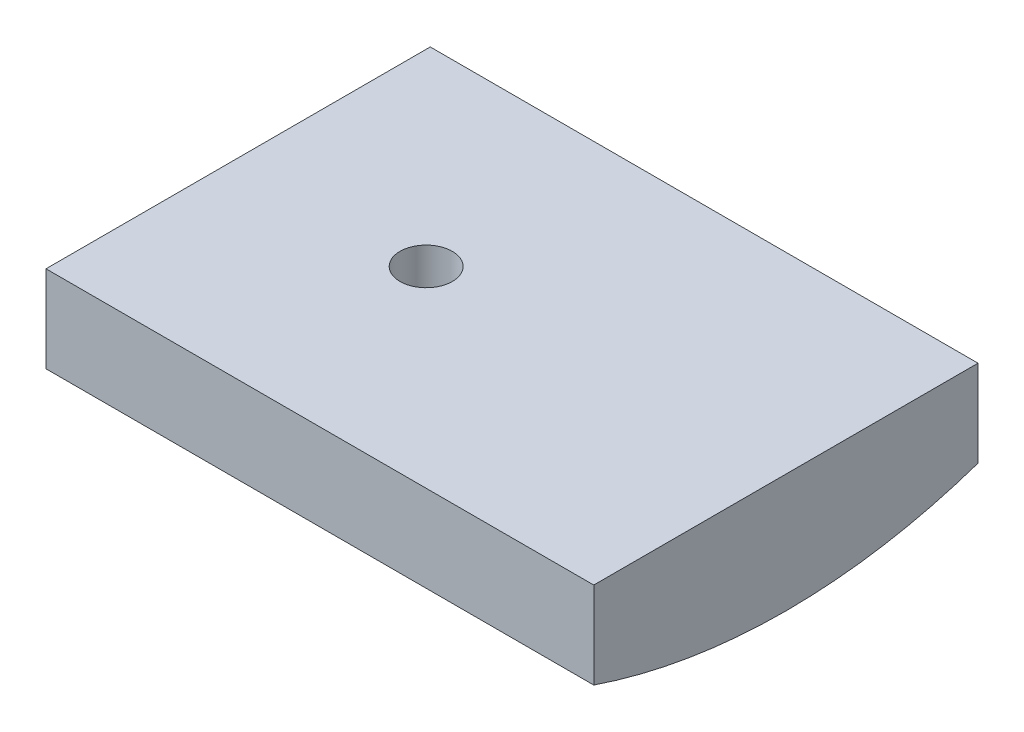
ISO-10303-21;
HEADER;
FILE_DESCRIPTION(('STEP AP214'),'2;1');
FILE_NAME('part.step','',(''),(''),'','','');
FILE_SCHEMA(('AUTOMOTIVE_DESIGN { 1 0 10303 214 1 1 1 1 }'));
ENDSEC;
DATA;
#1=APPLICATION_CONTEXT('core data for automotive mechanical design processes');
#2=APPLICATION_PROTOCOL_DEFINITION('international standard','automotive_design',2000,#1);
#3=PRODUCT_CONTEXT('',#1,'mechanical');
#4=PRODUCT('Part','Part','',(#3));
#5=PRODUCT_RELATED_PRODUCT_CATEGORY('part','',(#4));
#6=PRODUCT_DEFINITION_FORMATION('','',#4);
#7=PRODUCT_DEFINITION_CONTEXT('part definition',#1,'design');
#8=PRODUCT_DEFINITION('design','',#6,#7);
#9=PRODUCT_DEFINITION_SHAPE('','',#8);
#10=(LENGTH_UNIT() NAMED_UNIT(*) SI_UNIT(.MILLI.,.METRE.));
#11=(NAMED_UNIT(*) PLANE_ANGLE_UNIT() SI_UNIT($,.RADIAN.));
#12=(NAMED_UNIT(*) SI_UNIT($,.STERADIAN.) SOLID_ANGLE_UNIT());
#13=UNCERTAINTY_MEASURE_WITH_UNIT(LENGTH_MEASURE(1.E-05),#10,'distance_accuracy_value','');
#14=(GEOMETRIC_REPRESENTATION_CONTEXT(3) GLOBAL_UNCERTAINTY_ASSIGNED_CONTEXT((#13)) GLOBAL_UNIT_ASSIGNED_CONTEXT((#10,
#11,#12)) REPRESENTATION_CONTEXT('',''));
#15=CARTESIAN_POINT('',(0.,0.,0.));
#16=DIRECTION('',(0.,0.,1.));
#17=DIRECTION('',(1.,0.,0.));
#18=AXIS2_PLACEMENT_3D('',#15,#16,#17);
#19=CARTESIAN_POINT('',(67.,-58.2,23.5));
#20=DIRECTION('',(0.,0.,-1.));
#21=DIRECTION('',(-1.,0.,0.));
#22=AXIS2_PLACEMENT_3D('',#19,#20,#21);
#23=PLANE('',#22);
#24=DIRECTION('',(0.,-1.,0.));
#25=VECTOR('',#24,1.);
#26=CARTESIAN_POINT('',(0.,-58.2,23.5));
#27=LINE('',#26,#25);
#28=CARTESIAN_POINT('',(0.,-58.2,23.5));
#29=VERTEX_POINT('',#28);
#30=CARTESIAN_POINT('',(0.,-68.7970929618396,23.5));
#31=VERTEX_POINT('',#30);
#32=EDGE_CURVE('E111',#29,#31,#27,.T.);
#33=ORIENTED_EDGE('',*,*,#32,.T.);
#34=DIRECTION('',(-1.,0.,0.));
#35=VECTOR('',#34,1.);
#36=CARTESIAN_POINT('',(67.,-68.7970929618396,23.5));
#37=LINE('',#36,#35);
#38=CARTESIAN_POINT('',(67.,-68.7970929618396,23.5));
#39=VERTEX_POINT('',#38);
#40=EDGE_CURVE('E13',#39,#31,#37,.T.);
#41=ORIENTED_EDGE('',*,*,#40,.F.);
#42=DIRECTION('',(0.,-1.,0.));
#43=VECTOR('',#42,1.);
#44=CARTESIAN_POINT('',(67.,-58.2,23.5));
#45=LINE('',#44,#43);
#46=CARTESIAN_POINT('',(67.,-58.2,23.5));
#47=VERTEX_POINT('',#46);
#48=EDGE_CURVE('E99',#47,#39,#45,.T.);
#49=ORIENTED_EDGE('',*,*,#48,.F.);
#50=DIRECTION('',(-1.,0.,0.));
#51=VECTOR('',#50,1.);
#52=CARTESIAN_POINT('',(67.,-58.2,23.5));
#53=LINE('',#52,#51);
#54=EDGE_CURVE('E107',#47,#29,#53,.T.);
#55=ORIENTED_EDGE('',*,*,#54,.T.);
#56=EDGE_LOOP('',(#33,#41,#49,#55));
#57=FACE_BOUND('',#56,.T.);
#58=ADVANCED_FACE('F48',(#57),#23,.F.);
#59=CARTESIAN_POINT('',(67.,0.,0.));
#60=DIRECTION('',(-1.,0.,0.));
#61=DIRECTION('',(0.,0.,1.));
#62=AXIS2_PLACEMENT_3D('',#59,#60,#61);
#63=CYLINDRICAL_SURFACE('',#62,72.7);
#64=CARTESIAN_POINT('',(19.8,-72.7,0.));
#65=CARTESIAN_POINT('',(19.8000079376236,-72.6999990554287,0.179652062881812));
#66=CARTESIAN_POINT('',(19.8151796436715,-72.6993269450789,0.359432173869418));
#67=CARTESIAN_POINT('',(19.8754884681783,-72.6967103770145,0.71403475734098));
#68=CARTESIAN_POINT('',(19.9206610643304,-72.6947644129374,0.888851104373264));
#69=CARTESIAN_POINT('',(20.0396774808622,-72.689820431775,1.22833795987927));
#70=CARTESIAN_POINT('',(20.1135068951964,-72.6868229433733,1.39301351810225));
#71=CARTESIAN_POINT('',(20.2877195741472,-72.6801136860816,1.70758883492879));
#72=CARTESIAN_POINT('',(20.3880964953573,-72.6764020878825,1.85749211157273));
#73=CARTESIAN_POINT('',(20.6126469494018,-72.6686788957961,2.13843505349792));
#74=CARTESIAN_POINT('',(20.7368372971638,-72.6646670911576,2.26946127429659));
#75=CARTESIAN_POINT('',(21.0054565427258,-72.6567974685846,2.50881647550613));
#76=CARTESIAN_POINT('',(21.1498862594891,-72.6529396568894,2.61714453701881));
#77=CARTESIAN_POINT('',(21.4549509079921,-72.6458116477366,2.8080623111318));
#78=CARTESIAN_POINT('',(21.6155921167749,-72.6425416792637,2.89064200303334));
#79=CARTESIAN_POINT('',(21.94847544309,-72.6369605462404,3.02765447037027));
#80=CARTESIAN_POINT('',(22.1207174872047,-72.6346493756228,3.08208742391736));
#81=CARTESIAN_POINT('',(22.4717937811411,-72.6312482896395,3.16122703910324));
#82=CARTESIAN_POINT('',(22.6506236449267,-72.6301575763715,3.18595312307803));
#83=CARTESIAN_POINT('',(23.0098988573959,-72.6293180010394,3.20503702153765));
#84=CARTESIAN_POINT('',(23.1903441955396,-72.629569130227,3.19939503401011));
#85=CARTESIAN_POINT('',(23.5475962741997,-72.6313841784134,3.15791916919835));
#86=CARTESIAN_POINT('',(23.7244054555187,-72.6329471852365,3.12210627030827));
#87=CARTESIAN_POINT('',(24.0694999214922,-72.6372083751787,3.02133767412009));
#88=CARTESIAN_POINT('',(24.2377851761768,-72.6399065622888,2.95638187436416));
#89=CARTESIAN_POINT('',(24.561122403655,-72.6461350370864,2.79914732490531));
#90=CARTESIAN_POINT('',(24.7161697105328,-72.6496656165276,2.70685899223469));
#91=CARTESIAN_POINT('',(25.0085787558715,-72.6571606208149,2.49758611382831));
#92=CARTESIAN_POINT('',(25.1459403991672,-72.6611250479953,2.38060143521249));
#93=CARTESIAN_POINT('',(25.3992010512813,-72.6690449468368,2.12513815095188));
#94=CARTESIAN_POINT('',(25.5150817305473,-72.6730004080308,1.98664137268227));
#95=CARTESIAN_POINT('',(25.7219498323409,-72.6804532819541,1.69214924507685));
#96=CARTESIAN_POINT('',(25.8129372495813,-72.6839506945861,1.53615389202436));
#97=CARTESIAN_POINT('',(25.9674341776184,-72.6900933911275,1.21108220333011));
#98=CARTESIAN_POINT('',(26.0309430708177,-72.692738655884,1.04200557377898));
#99=CARTESIAN_POINT('',(26.1286682856015,-72.6968786215064,0.695575485589604));
#100=CARTESIAN_POINT('',(26.1628847773894,-72.6983733290576,0.518222075049894));
#101=CARTESIAN_POINT('',(26.2010313639421,-72.7000428544312,0.160432011088575));
#102=CARTESIAN_POINT('',(26.2049868156232,-72.7002187773126,-0.0200019339245599));
#103=CARTESIAN_POINT('',(26.1825651816905,-72.6992338369203,-0.378971099768307));
#104=CARTESIAN_POINT('',(26.1561881734479,-72.6980729770564,-0.557506325440951));
#105=CARTESIAN_POINT('',(26.0738713520104,-72.6945459610338,-0.907539173491347));
#106=CARTESIAN_POINT('',(26.0179430942224,-72.6921802760101,-1.07903951848601));
#107=CARTESIAN_POINT('',(25.8781230849649,-72.6865100344922,-1.4102181239945));
#108=CARTESIAN_POINT('',(25.794231209163,-72.6832054738235,-1.56989633194064));
#109=CARTESIAN_POINT('',(25.6008002872374,-72.6760266543423,-1.87301452475459));
#110=CARTESIAN_POINT('',(25.491244219004,-72.6721520180569,-2.01644363811627));
#111=CARTESIAN_POINT('',(25.2496197179993,-72.6642707770947,-2.28288295227253));
#112=CARTESIAN_POINT('',(25.1175511714724,-72.6602641717513,-2.40589304988363));
#113=CARTESIAN_POINT('',(24.8345417107376,-72.6525674646629,-2.62808766771594));
#114=CARTESIAN_POINT('',(24.6835879224301,-72.6488775817494,-2.72725579878869));
#115=CARTESIAN_POINT('',(24.3671582270869,-72.6422338191424,-2.89883946624275));
#116=CARTESIAN_POINT('',(24.201682372596,-72.639279936786,-2.97125509941698));
#117=CARTESIAN_POINT('',(23.8609668600686,-72.6344428138734,-3.08724951371949));
#118=CARTESIAN_POINT('',(23.6857307831402,-72.6325591834371,-3.13083879689023));
#119=CARTESIAN_POINT('',(23.3304188463857,-72.6300738648497,-3.18797754245829));
#120=CARTESIAN_POINT('',(23.1503430058559,-72.629472171588,-3.20152712460779));
#121=CARTESIAN_POINT('',(22.7906265346466,-72.6296187128525,-3.19820063739153));
#122=CARTESIAN_POINT('',(22.6109856643852,-72.6303658028949,-3.18135036323745));
#123=CARTESIAN_POINT('',(22.2570856935606,-72.6331232867382,-3.11775572805027));
#124=CARTESIAN_POINT('',(22.0828266034197,-72.6351336829855,-3.07101130912848));
#125=CARTESIAN_POINT('',(21.7446304629641,-72.6401909347824,-2.94896021917696));
#126=CARTESIAN_POINT('',(21.5806935313621,-72.6432378022496,-2.87365321972621));
#127=CARTESIAN_POINT('',(21.2677896855119,-72.6500244575355,-2.69661984052176));
#128=CARTESIAN_POINT('',(21.1188222833957,-72.6537642227609,-2.59489432215493));
#129=CARTESIAN_POINT('',(20.8399589550191,-72.6615186934287,-2.36782176292397));
#130=CARTESIAN_POINT('',(20.7100772293568,-72.6655336003645,-2.24245729037849));
#131=CARTESIAN_POINT('',(20.4731645299452,-72.6733846560034,-1.97166658654877));
#132=CARTESIAN_POINT('',(20.3661391983035,-72.6772207603867,-1.82623541634446));
#133=CARTESIAN_POINT('',(20.1779386052123,-72.684284071386,-1.51934570407453));
#134=CARTESIAN_POINT('',(20.0967853489111,-72.6875107587248,-1.35787367093634));
#135=CARTESIAN_POINT('',(19.9628370296418,-72.6929834158296,-1.023704344439));
#136=CARTESIAN_POINT('',(19.9100083583074,-72.6952305472869,-0.851020628335082));
#137=CARTESIAN_POINT('',(19.848116283448,-72.6978943349803,-0.564381362632088));
#138=CARTESIAN_POINT('',(19.8300955960055,-72.6986805046834,-0.452283846469388));
#139=CARTESIAN_POINT('',(19.8060349523401,-72.6997336352178,-0.226807901603281));
#140=CARTESIAN_POINT('',(19.7999949883099,-72.7000005963874,-0.113429473734627));
#141=CARTESIAN_POINT('',(19.8,-72.7,0.));
#142=B_SPLINE_CURVE_WITH_KNOTS('',3,(#64,#65,#66,#67,#68,#69,#70,#71,#72,#73,#74,#75,#76,#77,
#78,#79,#80,#81,#82,#83,#84,#85,#86,#87,#88,#89,#90,#91,#92,#93,#94,#95,#96,#97,#98,#99,#100,
#101,#102,#103,#104,#105,#106,#107,#108,#109,#110,#111,#112,#113,#114,#115,#116,#117,#118,#119,
#120,#121,#122,#123,#124,#125,#126,#127,#128,#129,#130,#131,#132,#133,#134,#135,#136,#137,#138,
#139,#140,#141),.UNSPECIFIED.,.T.,.F.,(4,2,2,2,2,2,2,2,2,2,2,2,2,2,2,2,2,2,2,2,2,2,2,2,2,2,2,2,
2,2,2,2,2,2,2,2,2,2,4),(0.,0.538542138544007,1.0777222692952,1.61663169956707,2.15541247602932,
2.69457510200244,3.23375955088533,3.77315357732897,4.31254419046182,4.85158195804778,
5.39061621132828,5.92927597314093,6.46793762873674,7.00678836671602,7.54564200408532,
8.08495334589407,8.62426480225208,9.16358837934961,9.70290882268752,10.2417772986512,
10.7806444000866,11.3193009444224,11.8579598837761,12.3969771123364,12.9359970646315,
13.4753864906504,14.0147739650911,14.5539648209721,15.0931535273845,15.6318849307854,
16.1706173774191,16.7093560187463,17.2480770964793,17.7871969990273,18.3264498300505,
18.8661600992441,19.4052285532338,19.7452557713247,20.0852827678371),.UNSPECIFIED.);
#143=CARTESIAN_POINT('',(19.8,-72.7,0.));
#144=VERTEX_POINT('',#143);
#145=EDGE_CURVE('E114',#144,#144,#142,.T.);
#146=ORIENTED_EDGE('',*,*,#145,.T.);
#147=EDGE_LOOP('',(#146));
#148=FACE_BOUND('',#147,.T.);
#149=CARTESIAN_POINT('',(0.,0.,0.));
#150=DIRECTION('',(1.,0.,0.));
#151=DIRECTION('',(0.,0.,-1.));
#152=AXIS2_PLACEMENT_3D('',#149,#150,#151);
#153=CIRCLE('',#152,72.7);
#154=CARTESIAN_POINT('',(0.,-68.7970929618396,-23.5));
#155=VERTEX_POINT('',#154);
#156=EDGE_CURVE('E103',#31,#155,#153,.T.);
#157=ORIENTED_EDGE('',*,*,#156,.T.);
#158=DIRECTION('',(-1.,0.,0.));
#159=VECTOR('',#158,1.);
#160=CARTESIAN_POINT('',(67.,-68.7970929618396,-23.5));
#161=LINE('',#160,#159);
#162=CARTESIAN_POINT('',(67.,-68.7970929618396,-23.5));
#163=VERTEX_POINT('',#162);
#164=EDGE_CURVE('E56',#163,#155,#161,.T.);
#165=ORIENTED_EDGE('',*,*,#164,.F.);
#166=CARTESIAN_POINT('',(67.,0.,0.));
#167=DIRECTION('',(1.,0.,0.));
#168=DIRECTION('',(0.,0.,-1.));
#169=AXIS2_PLACEMENT_3D('',#166,#167,#168);
#170=CIRCLE('',#169,72.7);
#171=EDGE_CURVE('E94',#39,#163,#170,.T.);
#172=ORIENTED_EDGE('',*,*,#171,.F.);
#173=ORIENTED_EDGE('',*,*,#40,.T.);
#174=EDGE_LOOP('',(#157,#165,#172,#173));
#175=FACE_BOUND('',#174,.T.);
#176=ADVANCED_FACE('F102',(#148,#175),#63,.T.);
#177=CARTESIAN_POINT('',(67.,-58.2,-23.5));
#178=DIRECTION('',(0.,0.,1.));
#179=DIRECTION('',(1.,0.,0.));
#180=AXIS2_PLACEMENT_3D('',#177,#178,#179);
#181=PLANE('',#180);
#182=DIRECTION('',(0.,1.,0.));
#183=VECTOR('',#182,1.);
#184=CARTESIAN_POINT('',(0.,-58.2,-23.5));
#185=LINE('',#184,#183);
#186=CARTESIAN_POINT('',(0.,-58.2,-23.5));
#187=VERTEX_POINT('',#186);
#188=EDGE_CURVE('E81',#155,#187,#185,.T.);
#189=ORIENTED_EDGE('',*,*,#188,.T.);
#190=DIRECTION('',(-1.,0.,0.));
#191=VECTOR('',#190,1.);
#192=CARTESIAN_POINT('',(67.,-58.2,-23.5));
#193=LINE('',#192,#191);
#194=CARTESIAN_POINT('',(67.,-58.2,-23.5));
#195=VERTEX_POINT('',#194);
#196=EDGE_CURVE('E104',#195,#187,#193,.T.);
#197=ORIENTED_EDGE('',*,*,#196,.F.);
#198=DIRECTION('',(0.,1.,0.));
#199=VECTOR('',#198,1.);
#200=CARTESIAN_POINT('',(67.,-58.2,-23.5));
#201=LINE('',#200,#199);
#202=EDGE_CURVE('E97',#163,#195,#201,.T.);
#203=ORIENTED_EDGE('',*,*,#202,.F.);
#204=ORIENTED_EDGE('',*,*,#164,.T.);
#205=EDGE_LOOP('',(#189,#197,#203,#204));
#206=FACE_BOUND('',#205,.T.);
#207=ADVANCED_FACE('F105',(#206),#181,.F.);
#208=CARTESIAN_POINT('',(67.,-58.2,23.5));
#209=DIRECTION('',(0.,-1.,0.));
#210=DIRECTION('',(0.,0.,-1.));
#211=AXIS2_PLACEMENT_3D('',#208,#209,#210);
#212=PLANE('',#211);
#213=CARTESIAN_POINT('',(23.,-58.2,0.));
#214=DIRECTION('',(0.,1.,0.));
#215=DIRECTION('',(0.,0.,1.));
#216=AXIS2_PLACEMENT_3D('',#213,#214,#215);
#217=CIRCLE('',#216,3.2);
#218=CARTESIAN_POINT('',(23.,-58.2,3.2));
#219=VERTEX_POINT('',#218);
#220=EDGE_CURVE('E130',#219,#219,#217,.T.);
#221=ORIENTED_EDGE('',*,*,#220,.F.);
#222=EDGE_LOOP('',(#221));
#223=FACE_BOUND('',#222,.T.);
#224=DIRECTION('',(0.,0.,1.));
#225=VECTOR('',#224,1.);
#226=CARTESIAN_POINT('',(0.,-58.2,23.5));
#227=LINE('',#226,#225);
#228=EDGE_CURVE('E87',#187,#29,#227,.T.);
#229=ORIENTED_EDGE('',*,*,#228,.T.);
#230=ORIENTED_EDGE('',*,*,#54,.F.);
#231=DIRECTION('',(0.,0.,1.));
#232=VECTOR('',#231,1.);
#233=CARTESIAN_POINT('',(67.,-58.2,23.5));
#234=LINE('',#233,#232);
#235=EDGE_CURVE('E64',#195,#47,#234,.T.);
#236=ORIENTED_EDGE('',*,*,#235,.F.);
#237=ORIENTED_EDGE('',*,*,#196,.T.);
#238=EDGE_LOOP('',(#229,#230,#236,#237));
#239=FACE_BOUND('',#238,.T.);
#240=ADVANCED_FACE('F119',(#223,#239),#212,.F.);
#241=CARTESIAN_POINT('',(67.,0.,0.));
#242=DIRECTION('',(1.,0.,0.));
#243=DIRECTION('',(0.,0.,-1.));
#244=AXIS2_PLACEMENT_3D('',#241,#242,#243);
#245=PLANE('',#244);
#246=ORIENTED_EDGE('',*,*,#48,.T.);
#247=ORIENTED_EDGE('',*,*,#171,.T.);
#248=ORIENTED_EDGE('',*,*,#202,.T.);
#249=ORIENTED_EDGE('',*,*,#235,.T.);
#250=EDGE_LOOP('',(#246,#247,#248,#249));
#251=FACE_BOUND('',#250,.T.);
#252=ADVANCED_FACE('F95',(#251),#245,.T.);
#253=CARTESIAN_POINT('',(0.,0.,0.));
#254=DIRECTION('',(1.,0.,0.));
#255=DIRECTION('',(0.,0.,-1.));
#256=AXIS2_PLACEMENT_3D('',#253,#254,#255);
#257=PLANE('',#256);
#258=ORIENTED_EDGE('',*,*,#32,.F.);
#259=ORIENTED_EDGE('',*,*,#228,.F.);
#260=ORIENTED_EDGE('',*,*,#188,.F.);
#261=ORIENTED_EDGE('',*,*,#156,.F.);
#262=EDGE_LOOP('',(#258,#259,#260,#261));
#263=FACE_BOUND('',#262,.T.);
#264=ADVANCED_FACE('F122',(#263),#257,.F.);
#265=CARTESIAN_POINT('',(23.,-72.7,0.));
#266=DIRECTION('',(0.,1.,0.));
#267=DIRECTION('',(0.,0.,1.));
#268=AXIS2_PLACEMENT_3D('',#265,#266,#267);
#269=CYLINDRICAL_SURFACE('',#268,3.2);
#270=ORIENTED_EDGE('',*,*,#220,.T.);
#271=EDGE_LOOP('',(#270));
#272=FACE_BOUND('',#271,.T.);
#273=ORIENTED_EDGE('',*,*,#145,.F.);
#274=EDGE_LOOP('',(#273));
#275=FACE_BOUND('',#274,.T.);
#276=ADVANCED_FACE('F133',(#272,#275),#269,.F.);
#277=CLOSED_SHELL('',(#58,#176,#207,#240,#252,#264,#276));
#278=MANIFOLD_SOLID_BREP('B2',#277);
#279=ADVANCED_BREP_SHAPE_REPRESENTATION('',(#18,#278),#14);
#280=SHAPE_DEFINITION_REPRESENTATION(#9,#279);
ENDSEC;
END-ISO-10303-21;
